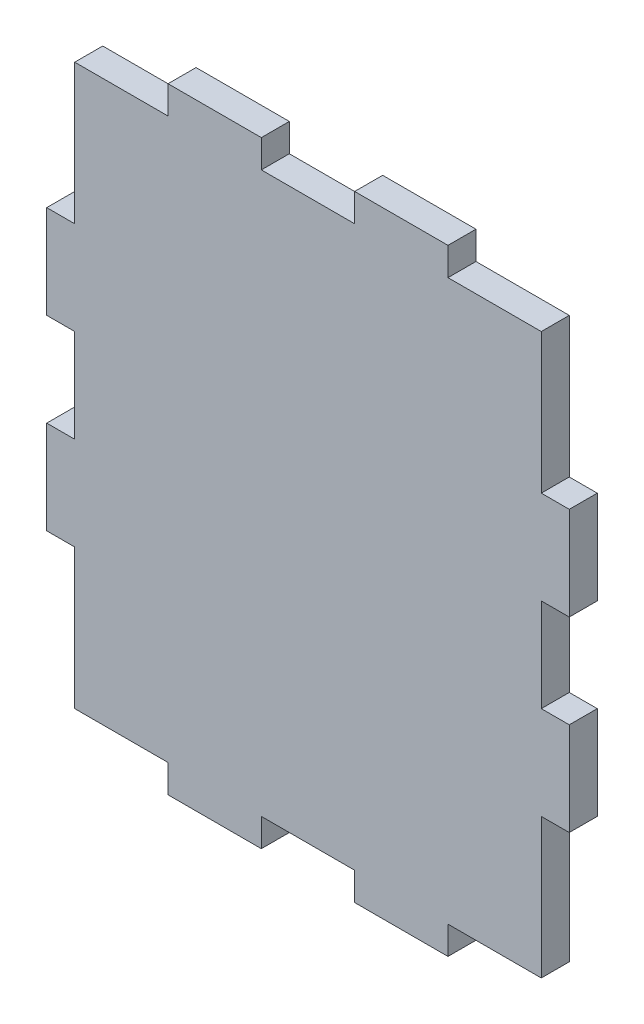
ISO-10303-21;
HEADER;
FILE_DESCRIPTION(('STEP AP214'),'2;1');
FILE_NAME('part.step','',(''),(''),'','','');
FILE_SCHEMA(('AUTOMOTIVE_DESIGN { 1 0 10303 214 1 1 1 1 }'));
ENDSEC;
DATA;
#1=APPLICATION_CONTEXT('core data for automotive mechanical design processes');
#2=APPLICATION_PROTOCOL_DEFINITION('international standard','automotive_design',2000,#1);
#3=PRODUCT_CONTEXT('',#1,'mechanical');
#4=PRODUCT('Part','Part','',(#3));
#5=PRODUCT_RELATED_PRODUCT_CATEGORY('part','',(#4));
#6=PRODUCT_DEFINITION_FORMATION('','',#4);
#7=PRODUCT_DEFINITION_CONTEXT('part definition',#1,'design');
#8=PRODUCT_DEFINITION('design','',#6,#7);
#9=PRODUCT_DEFINITION_SHAPE('','',#8);
#10=(LENGTH_UNIT() NAMED_UNIT(*) SI_UNIT(.MILLI.,.METRE.));
#11=(NAMED_UNIT(*) PLANE_ANGLE_UNIT() SI_UNIT($,.RADIAN.));
#12=(NAMED_UNIT(*) SI_UNIT($,.STERADIAN.) SOLID_ANGLE_UNIT());
#13=UNCERTAINTY_MEASURE_WITH_UNIT(LENGTH_MEASURE(1.E-05),#10,'distance_accuracy_value','');
#14=(GEOMETRIC_REPRESENTATION_CONTEXT(3) GLOBAL_UNCERTAINTY_ASSIGNED_CONTEXT((#13)) GLOBAL_UNIT_ASSIGNED_CONTEXT((#10,
#11,#12)) REPRESENTATION_CONTEXT('',''));
#15=CARTESIAN_POINT('',(0.,0.,0.));
#16=DIRECTION('',(0.,0.,1.));
#17=DIRECTION('',(1.,0.,0.));
#18=AXIS2_PLACEMENT_3D('',#15,#16,#17);
#19=CARTESIAN_POINT('',(-40.,-30.,6.));
#20=DIRECTION('',(1.,0.,0.));
#21=DIRECTION('',(0.,0.,-1.));
#22=AXIS2_PLACEMENT_3D('',#19,#20,#21);
#23=PLANE('',#22);
#24=DIRECTION('',(0.,-1.,0.));
#25=VECTOR('',#24,1.);
#26=CARTESIAN_POINT('',(-40.,-30.,0.));
#27=LINE('',#26,#25);
#28=CARTESIAN_POINT('',(-40.,0.,0.));
#29=VERTEX_POINT('',#28);
#30=CARTESIAN_POINT('',(-40.,-30.,0.));
#31=VERTEX_POINT('',#30);
#32=EDGE_CURVE('E297',#29,#31,#27,.T.);
#33=ORIENTED_EDGE('',*,*,#32,.T.);
#34=DIRECTION('',(0.,0.,-1.));
#35=VECTOR('',#34,1.);
#36=CARTESIAN_POINT('',(-40.,-30.,6.));
#37=LINE('',#36,#35);
#38=CARTESIAN_POINT('',(-40.,-30.,6.));
#39=VERTEX_POINT('',#38);
#40=EDGE_CURVE('E11',#39,#31,#37,.T.);
#41=ORIENTED_EDGE('',*,*,#40,.F.);
#42=DIRECTION('',(0.,-1.,0.));
#43=VECTOR('',#42,1.);
#44=CARTESIAN_POINT('',(-40.,-30.,6.));
#45=LINE('',#44,#43);
#46=CARTESIAN_POINT('',(-40.,0.,6.));
#47=VERTEX_POINT('',#46);
#48=EDGE_CURVE('E367',#47,#39,#45,.T.);
#49=ORIENTED_EDGE('',*,*,#48,.F.);
#50=DIRECTION('',(0.,0.,-1.));
#51=VECTOR('',#50,1.);
#52=CARTESIAN_POINT('',(-40.,0.,6.));
#53=LINE('',#52,#51);
#54=EDGE_CURVE('E293',#47,#29,#53,.T.);
#55=ORIENTED_EDGE('',*,*,#54,.T.);
#56=EDGE_LOOP('',(#33,#41,#49,#55));
#57=FACE_BOUND('',#56,.T.);
#58=ADVANCED_FACE('F33',(#57),#23,.F.);
#59=CARTESIAN_POINT('',(-46.,-30.,6.));
#60=DIRECTION('',(0.,-1.,0.));
#61=DIRECTION('',(0.,0.,-1.));
#62=AXIS2_PLACEMENT_3D('',#59,#60,#61);
#63=PLANE('',#62);
#64=DIRECTION('',(-1.,0.,0.));
#65=VECTOR('',#64,1.);
#66=CARTESIAN_POINT('',(-46.,-30.,0.));
#67=LINE('',#66,#65);
#68=CARTESIAN_POINT('',(-46.,-30.,0.));
#69=VERTEX_POINT('',#68);
#70=EDGE_CURVE('E300',#31,#69,#67,.T.);
#71=ORIENTED_EDGE('',*,*,#70,.T.);
#72=DIRECTION('',(0.,0.,-1.));
#73=VECTOR('',#72,1.);
#74=CARTESIAN_POINT('',(-46.,-30.,6.));
#75=LINE('',#74,#73);
#76=CARTESIAN_POINT('',(-46.,-30.,6.));
#77=VERTEX_POINT('',#76);
#78=EDGE_CURVE('E41',#77,#69,#75,.T.);
#79=ORIENTED_EDGE('',*,*,#78,.F.);
#80=DIRECTION('',(-1.,0.,0.));
#81=VECTOR('',#80,1.);
#82=CARTESIAN_POINT('',(-46.,-30.,6.));
#83=LINE('',#82,#81);
#84=EDGE_CURVE('E176',#39,#77,#83,.T.);
#85=ORIENTED_EDGE('',*,*,#84,.F.);
#86=ORIENTED_EDGE('',*,*,#40,.T.);
#87=EDGE_LOOP('',(#71,#79,#85,#86));
#88=FACE_BOUND('',#87,.T.);
#89=ADVANCED_FACE('F565',(#88),#63,.F.);
#90=CARTESIAN_POINT('',(-46.,-50.,6.));
#91=DIRECTION('',(1.,0.,0.));
#92=DIRECTION('',(0.,1.,0.));
#93=AXIS2_PLACEMENT_3D('',#90,#91,#92);
#94=PLANE('',#93);
#95=DIRECTION('',(0.,-1.,0.));
#96=VECTOR('',#95,1.);
#97=CARTESIAN_POINT('',(-46.,-50.,0.));
#98=LINE('',#97,#96);
#99=CARTESIAN_POINT('',(-46.,-50.,0.));
#100=VERTEX_POINT('',#99);
#101=EDGE_CURVE('E302',#69,#100,#98,.T.);
#102=ORIENTED_EDGE('',*,*,#101,.T.);
#103=DIRECTION('',(0.,0.,-1.));
#104=VECTOR('',#103,1.);
#105=CARTESIAN_POINT('',(-46.,-50.,6.));
#106=LINE('',#105,#104);
#107=CARTESIAN_POINT('',(-46.,-50.,6.));
#108=VERTEX_POINT('',#107);
#109=EDGE_CURVE('E458',#108,#100,#106,.T.);
#110=ORIENTED_EDGE('',*,*,#109,.F.);
#111=DIRECTION('',(0.,-1.,0.));
#112=VECTOR('',#111,1.);
#113=CARTESIAN_POINT('',(-46.,-50.,6.));
#114=LINE('',#113,#112);
#115=EDGE_CURVE('E466',#77,#108,#114,.T.);
#116=ORIENTED_EDGE('',*,*,#115,.F.);
#117=ORIENTED_EDGE('',*,*,#78,.T.);
#118=EDGE_LOOP('',(#102,#110,#116,#117));
#119=FACE_BOUND('',#118,.T.);
#120=ADVANCED_FACE('F464',(#119),#94,.F.);
#121=CARTESIAN_POINT('',(-40.,-50.,6.));
#122=DIRECTION('',(0.,1.,0.));
#123=DIRECTION('',(0.,0.,1.));
#124=AXIS2_PLACEMENT_3D('',#121,#122,#123);
#125=PLANE('',#124);
#126=DIRECTION('',(1.,0.,0.));
#127=VECTOR('',#126,1.);
#128=CARTESIAN_POINT('',(-40.,-50.,0.));
#129=LINE('',#128,#127);
#130=CARTESIAN_POINT('',(-40.,-50.,0.));
#131=VERTEX_POINT('',#130);
#132=EDGE_CURVE('E304',#100,#131,#129,.T.);
#133=ORIENTED_EDGE('',*,*,#132,.T.);
#134=DIRECTION('',(0.,0.,-1.));
#135=VECTOR('',#134,1.);
#136=CARTESIAN_POINT('',(-40.,-50.,6.));
#137=LINE('',#136,#135);
#138=CARTESIAN_POINT('',(-40.,-50.,6.));
#139=VERTEX_POINT('',#138);
#140=EDGE_CURVE('E455',#139,#131,#137,.T.);
#141=ORIENTED_EDGE('',*,*,#140,.F.);
#142=DIRECTION('',(1.,0.,0.));
#143=VECTOR('',#142,1.);
#144=CARTESIAN_POINT('',(-40.,-50.,6.));
#145=LINE('',#144,#143);
#146=EDGE_CURVE('E484',#108,#139,#145,.T.);
#147=ORIENTED_EDGE('',*,*,#146,.F.);
#148=ORIENTED_EDGE('',*,*,#109,.T.);
#149=EDGE_LOOP('',(#133,#141,#147,#148));
#150=FACE_BOUND('',#149,.T.);
#151=ADVANCED_FACE('F475',(#150),#125,.F.);
#152=CARTESIAN_POINT('',(-40.,-70.,6.));
#153=DIRECTION('',(1.,0.,0.));
#154=DIRECTION('',(0.,0.,-1.));
#155=AXIS2_PLACEMENT_3D('',#152,#153,#154);
#156=PLANE('',#155);
#157=DIRECTION('',(0.,-1.,0.));
#158=VECTOR('',#157,1.);
#159=CARTESIAN_POINT('',(-40.,-70.,0.));
#160=LINE('',#159,#158);
#161=CARTESIAN_POINT('',(-40.,-70.,0.));
#162=VERTEX_POINT('',#161);
#163=EDGE_CURVE('E306',#131,#162,#160,.T.);
#164=ORIENTED_EDGE('',*,*,#163,.T.);
#165=DIRECTION('',(0.,0.,-1.));
#166=VECTOR('',#165,1.);
#167=CARTESIAN_POINT('',(-40.,-70.,6.));
#168=LINE('',#167,#166);
#169=CARTESIAN_POINT('',(-40.,-70.,6.));
#170=VERTEX_POINT('',#169);
#171=EDGE_CURVE('E452',#170,#162,#168,.T.);
#172=ORIENTED_EDGE('',*,*,#171,.F.);
#173=DIRECTION('',(0.,-1.,0.));
#174=VECTOR('',#173,1.);
#175=CARTESIAN_POINT('',(-40.,-70.,6.));
#176=LINE('',#175,#174);
#177=EDGE_CURVE('E481',#139,#170,#176,.T.);
#178=ORIENTED_EDGE('',*,*,#177,.F.);
#179=ORIENTED_EDGE('',*,*,#140,.T.);
#180=EDGE_LOOP('',(#164,#172,#178,#179));
#181=FACE_BOUND('',#180,.T.);
#182=ADVANCED_FACE('F479',(#181),#156,.F.);
#183=CARTESIAN_POINT('',(-46.,-70.,6.));
#184=DIRECTION('',(0.,-1.,0.));
#185=DIRECTION('',(0.,0.,-1.));
#186=AXIS2_PLACEMENT_3D('',#183,#184,#185);
#187=PLANE('',#186);
#188=DIRECTION('',(-1.,0.,0.));
#189=VECTOR('',#188,1.);
#190=CARTESIAN_POINT('',(-46.,-70.,0.));
#191=LINE('',#190,#189);
#192=CARTESIAN_POINT('',(-46.,-70.,0.));
#193=VERTEX_POINT('',#192);
#194=EDGE_CURVE('E308',#162,#193,#191,.T.);
#195=ORIENTED_EDGE('',*,*,#194,.T.);
#196=DIRECTION('',(0.,0.,-1.));
#197=VECTOR('',#196,1.);
#198=CARTESIAN_POINT('',(-46.,-70.,6.));
#199=LINE('',#198,#197);
#200=CARTESIAN_POINT('',(-46.,-70.,6.));
#201=VERTEX_POINT('',#200);
#202=EDGE_CURVE('E449',#201,#193,#199,.T.);
#203=ORIENTED_EDGE('',*,*,#202,.F.);
#204=DIRECTION('',(-1.,0.,0.));
#205=VECTOR('',#204,1.);
#206=CARTESIAN_POINT('',(-46.,-70.,6.));
#207=LINE('',#206,#205);
#208=EDGE_CURVE('E483',#170,#201,#207,.T.);
#209=ORIENTED_EDGE('',*,*,#208,.F.);
#210=ORIENTED_EDGE('',*,*,#171,.T.);
#211=EDGE_LOOP('',(#195,#203,#209,#210));
#212=FACE_BOUND('',#211,.T.);
#213=ADVANCED_FACE('F578',(#212),#187,.F.);
#214=CARTESIAN_POINT('',(-46.,-90.,6.));
#215=DIRECTION('',(1.,0.,0.));
#216=DIRECTION('',(0.,1.,0.));
#217=AXIS2_PLACEMENT_3D('',#214,#215,#216);
#218=PLANE('',#217);
#219=DIRECTION('',(0.,-1.,0.));
#220=VECTOR('',#219,1.);
#221=CARTESIAN_POINT('',(-46.,-90.,0.));
#222=LINE('',#221,#220);
#223=CARTESIAN_POINT('',(-46.,-90.,0.));
#224=VERTEX_POINT('',#223);
#225=EDGE_CURVE('E310',#193,#224,#222,.T.);
#226=ORIENTED_EDGE('',*,*,#225,.T.);
#227=DIRECTION('',(0.,0.,-1.));
#228=VECTOR('',#227,1.);
#229=CARTESIAN_POINT('',(-46.,-90.,6.));
#230=LINE('',#229,#228);
#231=CARTESIAN_POINT('',(-46.,-90.,6.));
#232=VERTEX_POINT('',#231);
#233=EDGE_CURVE('E446',#232,#224,#230,.T.);
#234=ORIENTED_EDGE('',*,*,#233,.F.);
#235=DIRECTION('',(0.,-1.,0.));
#236=VECTOR('',#235,1.);
#237=CARTESIAN_POINT('',(-46.,-90.,6.));
#238=LINE('',#237,#236);
#239=EDGE_CURVE('E486',#201,#232,#238,.T.);
#240=ORIENTED_EDGE('',*,*,#239,.F.);
#241=ORIENTED_EDGE('',*,*,#202,.T.);
#242=EDGE_LOOP('',(#226,#234,#240,#241));
#243=FACE_BOUND('',#242,.T.);
#244=ADVANCED_FACE('F581',(#243),#218,.F.);
#245=CARTESIAN_POINT('',(-40.,-90.,6.));
#246=DIRECTION('',(0.,1.,0.));
#247=DIRECTION('',(0.,0.,1.));
#248=AXIS2_PLACEMENT_3D('',#245,#246,#247);
#249=PLANE('',#248);
#250=DIRECTION('',(1.,0.,0.));
#251=VECTOR('',#250,1.);
#252=CARTESIAN_POINT('',(-40.,-90.,0.));
#253=LINE('',#252,#251);
#254=CARTESIAN_POINT('',(-40.,-90.,0.));
#255=VERTEX_POINT('',#254);
#256=EDGE_CURVE('E312',#224,#255,#253,.T.);
#257=ORIENTED_EDGE('',*,*,#256,.T.);
#258=DIRECTION('',(0.,0.,-1.));
#259=VECTOR('',#258,1.);
#260=CARTESIAN_POINT('',(-40.,-90.,6.));
#261=LINE('',#260,#259);
#262=CARTESIAN_POINT('',(-40.,-90.,6.));
#263=VERTEX_POINT('',#262);
#264=EDGE_CURVE('E443',#263,#255,#261,.T.);
#265=ORIENTED_EDGE('',*,*,#264,.F.);
#266=DIRECTION('',(1.,0.,0.));
#267=VECTOR('',#266,1.);
#268=CARTESIAN_POINT('',(-40.,-90.,6.));
#269=LINE('',#268,#267);
#270=EDGE_CURVE('E492',#232,#263,#269,.T.);
#271=ORIENTED_EDGE('',*,*,#270,.F.);
#272=ORIENTED_EDGE('',*,*,#233,.T.);
#273=EDGE_LOOP('',(#257,#265,#271,#272));
#274=FACE_BOUND('',#273,.T.);
#275=ADVANCED_FACE('F585',(#274),#249,.F.);
#276=CARTESIAN_POINT('',(-40.,-120.,6.));
#277=DIRECTION('',(1.,0.,0.));
#278=DIRECTION('',(0.,1.,0.));
#279=AXIS2_PLACEMENT_3D('',#276,#277,#278);
#280=PLANE('',#279);
#281=DIRECTION('',(0.,-1.,0.));
#282=VECTOR('',#281,1.);
#283=CARTESIAN_POINT('',(-40.,-120.,0.));
#284=LINE('',#283,#282);
#285=CARTESIAN_POINT('',(-40.,-120.,0.));
#286=VERTEX_POINT('',#285);
#287=EDGE_CURVE('E314',#255,#286,#284,.T.);
#288=ORIENTED_EDGE('',*,*,#287,.T.);
#289=DIRECTION('',(0.,0.,-1.));
#290=VECTOR('',#289,1.);
#291=CARTESIAN_POINT('',(-40.,-120.,6.));
#292=LINE('',#291,#290);
#293=CARTESIAN_POINT('',(-40.,-120.,6.));
#294=VERTEX_POINT('',#293);
#295=EDGE_CURVE('E440',#294,#286,#292,.T.);
#296=ORIENTED_EDGE('',*,*,#295,.F.);
#297=DIRECTION('',(0.,-1.,0.));
#298=VECTOR('',#297,1.);
#299=CARTESIAN_POINT('',(-40.,-120.,6.));
#300=LINE('',#299,#298);
#301=EDGE_CURVE('E494',#263,#294,#300,.T.);
#302=ORIENTED_EDGE('',*,*,#301,.F.);
#303=ORIENTED_EDGE('',*,*,#264,.T.);
#304=EDGE_LOOP('',(#288,#296,#302,#303));
#305=FACE_BOUND('',#304,.T.);
#306=ADVANCED_FACE('F589',(#305),#280,.F.);
#307=CARTESIAN_POINT('',(-20.,-120.,6.));
#308=DIRECTION('',(0.,1.,0.));
#309=DIRECTION('',(-1.,0.,0.));
#310=AXIS2_PLACEMENT_3D('',#307,#308,#309);
#311=PLANE('',#310);
#312=DIRECTION('',(1.,0.,0.));
#313=VECTOR('',#312,1.);
#314=CARTESIAN_POINT('',(-20.,-120.,0.));
#315=LINE('',#314,#313);
#316=CARTESIAN_POINT('',(-20.,-120.,0.));
#317=VERTEX_POINT('',#316);
#318=EDGE_CURVE('E316',#286,#317,#315,.T.);
#319=ORIENTED_EDGE('',*,*,#318,.T.);
#320=DIRECTION('',(0.,0.,-1.));
#321=VECTOR('',#320,1.);
#322=CARTESIAN_POINT('',(-20.,-120.,6.));
#323=LINE('',#322,#321);
#324=CARTESIAN_POINT('',(-20.,-120.,6.));
#325=VERTEX_POINT('',#324);
#326=EDGE_CURVE('E437',#325,#317,#323,.T.);
#327=ORIENTED_EDGE('',*,*,#326,.F.);
#328=DIRECTION('',(1.,0.,0.));
#329=VECTOR('',#328,1.);
#330=CARTESIAN_POINT('',(-20.,-120.,6.));
#331=LINE('',#330,#329);
#332=EDGE_CURVE('E496',#294,#325,#331,.T.);
#333=ORIENTED_EDGE('',*,*,#332,.F.);
#334=ORIENTED_EDGE('',*,*,#295,.T.);
#335=EDGE_LOOP('',(#319,#327,#333,#334));
#336=FACE_BOUND('',#335,.T.);
#337=ADVANCED_FACE('F593',(#336),#311,.F.);
#338=CARTESIAN_POINT('',(-20.,-126.,6.));
#339=DIRECTION('',(1.,0.,0.));
#340=DIRECTION('',(0.,1.,0.));
#341=AXIS2_PLACEMENT_3D('',#338,#339,#340);
#342=PLANE('',#341);
#343=DIRECTION('',(0.,-1.,0.));
#344=VECTOR('',#343,1.);
#345=CARTESIAN_POINT('',(-20.,-126.,0.));
#346=LINE('',#345,#344);
#347=CARTESIAN_POINT('',(-20.,-126.,0.));
#348=VERTEX_POINT('',#347);
#349=EDGE_CURVE('E318',#317,#348,#346,.T.);
#350=ORIENTED_EDGE('',*,*,#349,.T.);
#351=DIRECTION('',(0.,0.,-1.));
#352=VECTOR('',#351,1.);
#353=CARTESIAN_POINT('',(-20.,-126.,6.));
#354=LINE('',#353,#352);
#355=CARTESIAN_POINT('',(-20.,-126.,6.));
#356=VERTEX_POINT('',#355);
#357=EDGE_CURVE('E434',#356,#348,#354,.T.);
#358=ORIENTED_EDGE('',*,*,#357,.F.);
#359=DIRECTION('',(0.,-1.,0.));
#360=VECTOR('',#359,1.);
#361=CARTESIAN_POINT('',(-20.,-126.,6.));
#362=LINE('',#361,#360);
#363=EDGE_CURVE('E498',#325,#356,#362,.T.);
#364=ORIENTED_EDGE('',*,*,#363,.F.);
#365=ORIENTED_EDGE('',*,*,#326,.T.);
#366=EDGE_LOOP('',(#350,#358,#364,#365));
#367=FACE_BOUND('',#366,.T.);
#368=ADVANCED_FACE('F597',(#367),#342,.F.);
#369=CARTESIAN_POINT('',(0.,-126.,6.));
#370=DIRECTION('',(0.,1.,0.));
#371=DIRECTION('',(0.,0.,1.));
#372=AXIS2_PLACEMENT_3D('',#369,#370,#371);
#373=PLANE('',#372);
#374=DIRECTION('',(1.,0.,0.));
#375=VECTOR('',#374,1.);
#376=CARTESIAN_POINT('',(0.,-126.,0.));
#377=LINE('',#376,#375);
#378=CARTESIAN_POINT('',(0.,-126.,0.));
#379=VERTEX_POINT('',#378);
#380=EDGE_CURVE('E320',#348,#379,#377,.T.);
#381=ORIENTED_EDGE('',*,*,#380,.T.);
#382=DIRECTION('',(0.,0.,-1.));
#383=VECTOR('',#382,1.);
#384=CARTESIAN_POINT('',(0.,-126.,6.));
#385=LINE('',#384,#383);
#386=CARTESIAN_POINT('',(0.,-126.,6.));
#387=VERTEX_POINT('',#386);
#388=EDGE_CURVE('E431',#387,#379,#385,.T.);
#389=ORIENTED_EDGE('',*,*,#388,.F.);
#390=DIRECTION('',(1.,0.,0.));
#391=VECTOR('',#390,1.);
#392=CARTESIAN_POINT('',(0.,-126.,6.));
#393=LINE('',#392,#391);
#394=EDGE_CURVE('E500',#356,#387,#393,.T.);
#395=ORIENTED_EDGE('',*,*,#394,.F.);
#396=ORIENTED_EDGE('',*,*,#357,.T.);
#397=EDGE_LOOP('',(#381,#389,#395,#396));
#398=FACE_BOUND('',#397,.T.);
#399=ADVANCED_FACE('F601',(#398),#373,.F.);
#400=CARTESIAN_POINT('',(0.,-120.,6.));
#401=DIRECTION('',(-1.,0.,0.));
#402=DIRECTION('',(0.,-1.,0.));
#403=AXIS2_PLACEMENT_3D('',#400,#401,#402);
#404=PLANE('',#403);
#405=DIRECTION('',(0.,1.,0.));
#406=VECTOR('',#405,1.);
#407=CARTESIAN_POINT('',(0.,-120.,0.));
#408=LINE('',#407,#406);
#409=CARTESIAN_POINT('',(0.,-120.,0.));
#410=VERTEX_POINT('',#409);
#411=EDGE_CURVE('E322',#379,#410,#408,.T.);
#412=ORIENTED_EDGE('',*,*,#411,.T.);
#413=DIRECTION('',(0.,0.,-1.));
#414=VECTOR('',#413,1.);
#415=CARTESIAN_POINT('',(0.,-120.,6.));
#416=LINE('',#415,#414);
#417=CARTESIAN_POINT('',(0.,-120.,6.));
#418=VERTEX_POINT('',#417);
#419=EDGE_CURVE('E428',#418,#410,#416,.T.);
#420=ORIENTED_EDGE('',*,*,#419,.F.);
#421=DIRECTION('',(0.,1.,0.));
#422=VECTOR('',#421,1.);
#423=CARTESIAN_POINT('',(0.,-120.,6.));
#424=LINE('',#423,#422);
#425=EDGE_CURVE('E502',#387,#418,#424,.T.);
#426=ORIENTED_EDGE('',*,*,#425,.F.);
#427=ORIENTED_EDGE('',*,*,#388,.T.);
#428=EDGE_LOOP('',(#412,#420,#426,#427));
#429=FACE_BOUND('',#428,.T.);
#430=ADVANCED_FACE('F605',(#429),#404,.F.);
#431=CARTESIAN_POINT('',(20.,-120.,6.));
#432=DIRECTION('',(0.,1.,0.));
#433=DIRECTION('',(0.,0.,1.));
#434=AXIS2_PLACEMENT_3D('',#431,#432,#433);
#435=PLANE('',#434);
#436=DIRECTION('',(1.,0.,0.));
#437=VECTOR('',#436,1.);
#438=CARTESIAN_POINT('',(20.,-120.,0.));
#439=LINE('',#438,#437);
#440=CARTESIAN_POINT('',(20.,-120.,0.));
#441=VERTEX_POINT('',#440);
#442=EDGE_CURVE('E324',#410,#441,#439,.T.);
#443=ORIENTED_EDGE('',*,*,#442,.T.);
#444=DIRECTION('',(0.,0.,-1.));
#445=VECTOR('',#444,1.);
#446=CARTESIAN_POINT('',(20.,-120.,6.));
#447=LINE('',#446,#445);
#448=CARTESIAN_POINT('',(20.,-120.,6.));
#449=VERTEX_POINT('',#448);
#450=EDGE_CURVE('E425',#449,#441,#447,.T.);
#451=ORIENTED_EDGE('',*,*,#450,.F.);
#452=DIRECTION('',(1.,0.,0.));
#453=VECTOR('',#452,1.);
#454=CARTESIAN_POINT('',(20.,-120.,6.));
#455=LINE('',#454,#453);
#456=EDGE_CURVE('E504',#418,#449,#455,.T.);
#457=ORIENTED_EDGE('',*,*,#456,.F.);
#458=ORIENTED_EDGE('',*,*,#419,.T.);
#459=EDGE_LOOP('',(#443,#451,#457,#458));
#460=FACE_BOUND('',#459,.T.);
#461=ADVANCED_FACE('F609',(#460),#435,.F.);
#462=CARTESIAN_POINT('',(20.,-126.,6.));
#463=DIRECTION('',(1.,0.,0.));
#464=DIRECTION('',(0.,0.,-1.));
#465=AXIS2_PLACEMENT_3D('',#462,#463,#464);
#466=PLANE('',#465);
#467=DIRECTION('',(0.,-1.,0.));
#468=VECTOR('',#467,1.);
#469=CARTESIAN_POINT('',(20.,-126.,0.));
#470=LINE('',#469,#468);
#471=CARTESIAN_POINT('',(20.,-126.,0.));
#472=VERTEX_POINT('',#471);
#473=EDGE_CURVE('E326',#441,#472,#470,.T.);
#474=ORIENTED_EDGE('',*,*,#473,.T.);
#475=DIRECTION('',(0.,0.,-1.));
#476=VECTOR('',#475,1.);
#477=CARTESIAN_POINT('',(20.,-126.,6.));
#478=LINE('',#477,#476);
#479=CARTESIAN_POINT('',(20.,-126.,6.));
#480=VERTEX_POINT('',#479);
#481=EDGE_CURVE('E422',#480,#472,#478,.T.);
#482=ORIENTED_EDGE('',*,*,#481,.F.);
#483=DIRECTION('',(0.,-1.,0.));
#484=VECTOR('',#483,1.);
#485=CARTESIAN_POINT('',(20.,-126.,6.));
#486=LINE('',#485,#484);
#487=EDGE_CURVE('E506',#449,#480,#486,.T.);
#488=ORIENTED_EDGE('',*,*,#487,.F.);
#489=ORIENTED_EDGE('',*,*,#450,.T.);
#490=EDGE_LOOP('',(#474,#482,#488,#489));
#491=FACE_BOUND('',#490,.T.);
#492=ADVANCED_FACE('F613',(#491),#466,.F.);
#493=CARTESIAN_POINT('',(40.,-126.,6.));
#494=DIRECTION('',(0.,1.,0.));
#495=DIRECTION('',(0.,0.,1.));
#496=AXIS2_PLACEMENT_3D('',#493,#494,#495);
#497=PLANE('',#496);
#498=DIRECTION('',(1.,0.,0.));
#499=VECTOR('',#498,1.);
#500=CARTESIAN_POINT('',(40.,-126.,0.));
#501=LINE('',#500,#499);
#502=CARTESIAN_POINT('',(40.,-126.,0.));
#503=VERTEX_POINT('',#502);
#504=EDGE_CURVE('E328',#472,#503,#501,.T.);
#505=ORIENTED_EDGE('',*,*,#504,.T.);
#506=DIRECTION('',(0.,0.,-1.));
#507=VECTOR('',#506,1.);
#508=CARTESIAN_POINT('',(40.,-126.,6.));
#509=LINE('',#508,#507);
#510=CARTESIAN_POINT('',(40.,-126.,6.));
#511=VERTEX_POINT('',#510);
#512=EDGE_CURVE('E419',#511,#503,#509,.T.);
#513=ORIENTED_EDGE('',*,*,#512,.F.);
#514=DIRECTION('',(1.,0.,0.));
#515=VECTOR('',#514,1.);
#516=CARTESIAN_POINT('',(40.,-126.,6.));
#517=LINE('',#516,#515);
#518=EDGE_CURVE('E508',#480,#511,#517,.T.);
#519=ORIENTED_EDGE('',*,*,#518,.F.);
#520=ORIENTED_EDGE('',*,*,#481,.T.);
#521=EDGE_LOOP('',(#505,#513,#519,#520));
#522=FACE_BOUND('',#521,.T.);
#523=ADVANCED_FACE('F617',(#522),#497,.F.);
#524=CARTESIAN_POINT('',(40.,-120.,6.));
#525=DIRECTION('',(-1.,0.,0.));
#526=DIRECTION('',(0.,-1.,0.));
#527=AXIS2_PLACEMENT_3D('',#524,#525,#526);
#528=PLANE('',#527);
#529=DIRECTION('',(0.,1.,0.));
#530=VECTOR('',#529,1.);
#531=CARTESIAN_POINT('',(40.,-120.,0.));
#532=LINE('',#531,#530);
#533=CARTESIAN_POINT('',(40.,-120.,0.));
#534=VERTEX_POINT('',#533);
#535=EDGE_CURVE('E330',#503,#534,#532,.T.);
#536=ORIENTED_EDGE('',*,*,#535,.T.);
#537=DIRECTION('',(0.,0.,-1.));
#538=VECTOR('',#537,1.);
#539=CARTESIAN_POINT('',(40.,-120.,6.));
#540=LINE('',#539,#538);
#541=CARTESIAN_POINT('',(40.,-120.,6.));
#542=VERTEX_POINT('',#541);
#543=EDGE_CURVE('E416',#542,#534,#540,.T.);
#544=ORIENTED_EDGE('',*,*,#543,.F.);
#545=DIRECTION('',(0.,1.,0.));
#546=VECTOR('',#545,1.);
#547=CARTESIAN_POINT('',(40.,-120.,6.));
#548=LINE('',#547,#546);
#549=EDGE_CURVE('E510',#511,#542,#548,.T.);
#550=ORIENTED_EDGE('',*,*,#549,.F.);
#551=ORIENTED_EDGE('',*,*,#512,.T.);
#552=EDGE_LOOP('',(#536,#544,#550,#551));
#553=FACE_BOUND('',#552,.T.);
#554=ADVANCED_FACE('F621',(#553),#528,.F.);
#555=CARTESIAN_POINT('',(60.,-120.,6.));
#556=DIRECTION('',(0.,1.,0.));
#557=DIRECTION('',(-1.,0.,0.));
#558=AXIS2_PLACEMENT_3D('',#555,#556,#557);
#559=PLANE('',#558);
#560=DIRECTION('',(1.,0.,0.));
#561=VECTOR('',#560,1.);
#562=CARTESIAN_POINT('',(60.,-120.,0.));
#563=LINE('',#562,#561);
#564=CARTESIAN_POINT('',(60.,-120.,0.));
#565=VERTEX_POINT('',#564);
#566=EDGE_CURVE('E332',#534,#565,#563,.T.);
#567=ORIENTED_EDGE('',*,*,#566,.T.);
#568=DIRECTION('',(0.,0.,-1.));
#569=VECTOR('',#568,1.);
#570=CARTESIAN_POINT('',(60.,-120.,6.));
#571=LINE('',#570,#569);
#572=CARTESIAN_POINT('',(60.,-120.,6.));
#573=VERTEX_POINT('',#572);
#574=EDGE_CURVE('E413',#573,#565,#571,.T.);
#575=ORIENTED_EDGE('',*,*,#574,.F.);
#576=DIRECTION('',(1.,0.,0.));
#577=VECTOR('',#576,1.);
#578=CARTESIAN_POINT('',(60.,-120.,6.));
#579=LINE('',#578,#577);
#580=EDGE_CURVE('E512',#542,#573,#579,.T.);
#581=ORIENTED_EDGE('',*,*,#580,.F.);
#582=ORIENTED_EDGE('',*,*,#543,.T.);
#583=EDGE_LOOP('',(#567,#575,#581,#582));
#584=FACE_BOUND('',#583,.T.);
#585=ADVANCED_FACE('F625',(#584),#559,.F.);
#586=CARTESIAN_POINT('',(60.,-90.,6.));
#587=DIRECTION('',(-1.,0.,0.));
#588=DIRECTION('',(0.,0.,1.));
#589=AXIS2_PLACEMENT_3D('',#586,#587,#588);
#590=PLANE('',#589);
#591=DIRECTION('',(0.,1.,0.));
#592=VECTOR('',#591,1.);
#593=CARTESIAN_POINT('',(60.,-90.,0.));
#594=LINE('',#593,#592);
#595=CARTESIAN_POINT('',(60.,-90.,0.));
#596=VERTEX_POINT('',#595);
#597=EDGE_CURVE('E334',#565,#596,#594,.T.);
#598=ORIENTED_EDGE('',*,*,#597,.T.);
#599=DIRECTION('',(0.,0.,-1.));
#600=VECTOR('',#599,1.);
#601=CARTESIAN_POINT('',(60.,-90.,6.));
#602=LINE('',#601,#600);
#603=CARTESIAN_POINT('',(60.,-90.,6.));
#604=VERTEX_POINT('',#603);
#605=EDGE_CURVE('E410',#604,#596,#602,.T.);
#606=ORIENTED_EDGE('',*,*,#605,.F.);
#607=DIRECTION('',(0.,1.,0.));
#608=VECTOR('',#607,1.);
#609=CARTESIAN_POINT('',(60.,-90.,6.));
#610=LINE('',#609,#608);
#611=EDGE_CURVE('E514',#573,#604,#610,.T.);
#612=ORIENTED_EDGE('',*,*,#611,.F.);
#613=ORIENTED_EDGE('',*,*,#574,.T.);
#614=EDGE_LOOP('',(#598,#606,#612,#613));
#615=FACE_BOUND('',#614,.T.);
#616=ADVANCED_FACE('F629',(#615),#590,.F.);
#617=CARTESIAN_POINT('',(66.,-90.,6.));
#618=DIRECTION('',(0.,1.,0.));
#619=DIRECTION('',(0.,0.,1.));
#620=AXIS2_PLACEMENT_3D('',#617,#618,#619);
#621=PLANE('',#620);
#622=DIRECTION('',(1.,0.,0.));
#623=VECTOR('',#622,1.);
#624=CARTESIAN_POINT('',(66.,-90.,0.));
#625=LINE('',#624,#623);
#626=CARTESIAN_POINT('',(66.,-90.,0.));
#627=VERTEX_POINT('',#626);
#628=EDGE_CURVE('E336',#596,#627,#625,.T.);
#629=ORIENTED_EDGE('',*,*,#628,.T.);
#630=DIRECTION('',(0.,0.,-1.));
#631=VECTOR('',#630,1.);
#632=CARTESIAN_POINT('',(66.,-90.,6.));
#633=LINE('',#632,#631);
#634=CARTESIAN_POINT('',(66.,-90.,6.));
#635=VERTEX_POINT('',#634);
#636=EDGE_CURVE('E407',#635,#627,#633,.T.);
#637=ORIENTED_EDGE('',*,*,#636,.F.);
#638=DIRECTION('',(1.,0.,0.));
#639=VECTOR('',#638,1.);
#640=CARTESIAN_POINT('',(66.,-90.,6.));
#641=LINE('',#640,#639);
#642=EDGE_CURVE('E516',#604,#635,#641,.T.);
#643=ORIENTED_EDGE('',*,*,#642,.F.);
#644=ORIENTED_EDGE('',*,*,#605,.T.);
#645=EDGE_LOOP('',(#629,#637,#643,#644));
#646=FACE_BOUND('',#645,.T.);
#647=ADVANCED_FACE('F633',(#646),#621,.F.);
#648=CARTESIAN_POINT('',(66.,-70.,6.));
#649=DIRECTION('',(-1.,0.,0.));
#650=DIRECTION('',(0.,-1.,0.));
#651=AXIS2_PLACEMENT_3D('',#648,#649,#650);
#652=PLANE('',#651);
#653=DIRECTION('',(0.,1.,0.));
#654=VECTOR('',#653,1.);
#655=CARTESIAN_POINT('',(66.,-70.,0.));
#656=LINE('',#655,#654);
#657=CARTESIAN_POINT('',(66.,-70.,0.));
#658=VERTEX_POINT('',#657);
#659=EDGE_CURVE('E338',#627,#658,#656,.T.);
#660=ORIENTED_EDGE('',*,*,#659,.T.);
#661=DIRECTION('',(0.,0.,-1.));
#662=VECTOR('',#661,1.);
#663=CARTESIAN_POINT('',(66.,-70.,6.));
#664=LINE('',#663,#662);
#665=CARTESIAN_POINT('',(66.,-70.,6.));
#666=VERTEX_POINT('',#665);
#667=EDGE_CURVE('E404',#666,#658,#664,.T.);
#668=ORIENTED_EDGE('',*,*,#667,.F.);
#669=DIRECTION('',(0.,1.,0.));
#670=VECTOR('',#669,1.);
#671=CARTESIAN_POINT('',(66.,-70.,6.));
#672=LINE('',#671,#670);
#673=EDGE_CURVE('E518',#635,#666,#672,.T.);
#674=ORIENTED_EDGE('',*,*,#673,.F.);
#675=ORIENTED_EDGE('',*,*,#636,.T.);
#676=EDGE_LOOP('',(#660,#668,#674,#675));
#677=FACE_BOUND('',#676,.T.);
#678=ADVANCED_FACE('F637',(#677),#652,.F.);
#679=CARTESIAN_POINT('',(60.,-70.,6.));
#680=DIRECTION('',(0.,-1.,0.));
#681=DIRECTION('',(0.,0.,-1.));
#682=AXIS2_PLACEMENT_3D('',#679,#680,#681);
#683=PLANE('',#682);
#684=DIRECTION('',(-1.,0.,0.));
#685=VECTOR('',#684,1.);
#686=CARTESIAN_POINT('',(60.,-70.,0.));
#687=LINE('',#686,#685);
#688=CARTESIAN_POINT('',(60.,-70.,0.));
#689=VERTEX_POINT('',#688);
#690=EDGE_CURVE('E340',#658,#689,#687,.T.);
#691=ORIENTED_EDGE('',*,*,#690,.T.);
#692=DIRECTION('',(0.,0.,-1.));
#693=VECTOR('',#692,1.);
#694=CARTESIAN_POINT('',(60.,-70.,6.));
#695=LINE('',#694,#693);
#696=CARTESIAN_POINT('',(60.,-70.,6.));
#697=VERTEX_POINT('',#696);
#698=EDGE_CURVE('E401',#697,#689,#695,.T.);
#699=ORIENTED_EDGE('',*,*,#698,.F.);
#700=DIRECTION('',(-1.,0.,0.));
#701=VECTOR('',#700,1.);
#702=CARTESIAN_POINT('',(60.,-70.,6.));
#703=LINE('',#702,#701);
#704=EDGE_CURVE('E520',#666,#697,#703,.T.);
#705=ORIENTED_EDGE('',*,*,#704,.F.);
#706=ORIENTED_EDGE('',*,*,#667,.T.);
#707=EDGE_LOOP('',(#691,#699,#705,#706));
#708=FACE_BOUND('',#707,.T.);
#709=ADVANCED_FACE('F641',(#708),#683,.F.);
#710=CARTESIAN_POINT('',(60.,-50.,6.));
#711=DIRECTION('',(-1.,0.,0.));
#712=DIRECTION('',(0.,0.,1.));
#713=AXIS2_PLACEMENT_3D('',#710,#711,#712);
#714=PLANE('',#713);
#715=DIRECTION('',(0.,1.,0.));
#716=VECTOR('',#715,1.);
#717=CARTESIAN_POINT('',(60.,-50.,0.));
#718=LINE('',#717,#716);
#719=CARTESIAN_POINT('',(60.,-50.,0.));
#720=VERTEX_POINT('',#719);
#721=EDGE_CURVE('E342',#689,#720,#718,.T.);
#722=ORIENTED_EDGE('',*,*,#721,.T.);
#723=DIRECTION('',(0.,0.,-1.));
#724=VECTOR('',#723,1.);
#725=CARTESIAN_POINT('',(60.,-50.,6.));
#726=LINE('',#725,#724);
#727=CARTESIAN_POINT('',(60.,-50.,6.));
#728=VERTEX_POINT('',#727);
#729=EDGE_CURVE('E398',#728,#720,#726,.T.);
#730=ORIENTED_EDGE('',*,*,#729,.F.);
#731=DIRECTION('',(0.,1.,0.));
#732=VECTOR('',#731,1.);
#733=CARTESIAN_POINT('',(60.,-50.,6.));
#734=LINE('',#733,#732);
#735=EDGE_CURVE('E522',#697,#728,#734,.T.);
#736=ORIENTED_EDGE('',*,*,#735,.F.);
#737=ORIENTED_EDGE('',*,*,#698,.T.);
#738=EDGE_LOOP('',(#722,#730,#736,#737));
#739=FACE_BOUND('',#738,.T.);
#740=ADVANCED_FACE('F645',(#739),#714,.F.);
#741=CARTESIAN_POINT('',(66.,-50.,6.));
#742=DIRECTION('',(0.,1.,0.));
#743=DIRECTION('',(0.,0.,1.));
#744=AXIS2_PLACEMENT_3D('',#741,#742,#743);
#745=PLANE('',#744);
#746=DIRECTION('',(1.,0.,0.));
#747=VECTOR('',#746,1.);
#748=CARTESIAN_POINT('',(66.,-50.,0.));
#749=LINE('',#748,#747);
#750=CARTESIAN_POINT('',(66.,-50.,0.));
#751=VERTEX_POINT('',#750);
#752=EDGE_CURVE('E344',#720,#751,#749,.T.);
#753=ORIENTED_EDGE('',*,*,#752,.T.);
#754=DIRECTION('',(0.,0.,-1.));
#755=VECTOR('',#754,1.);
#756=CARTESIAN_POINT('',(66.,-50.,6.));
#757=LINE('',#756,#755);
#758=CARTESIAN_POINT('',(66.,-50.,6.));
#759=VERTEX_POINT('',#758);
#760=EDGE_CURVE('E395',#759,#751,#757,.T.);
#761=ORIENTED_EDGE('',*,*,#760,.F.);
#762=DIRECTION('',(1.,0.,0.));
#763=VECTOR('',#762,1.);
#764=CARTESIAN_POINT('',(66.,-50.,6.));
#765=LINE('',#764,#763);
#766=EDGE_CURVE('E524',#728,#759,#765,.T.);
#767=ORIENTED_EDGE('',*,*,#766,.F.);
#768=ORIENTED_EDGE('',*,*,#729,.T.);
#769=EDGE_LOOP('',(#753,#761,#767,#768));
#770=FACE_BOUND('',#769,.T.);
#771=ADVANCED_FACE('F649',(#770),#745,.F.);
#772=CARTESIAN_POINT('',(66.,-30.,6.));
#773=DIRECTION('',(-1.,0.,0.));
#774=DIRECTION('',(0.,0.,1.));
#775=AXIS2_PLACEMENT_3D('',#772,#773,#774);
#776=PLANE('',#775);
#777=DIRECTION('',(0.,1.,0.));
#778=VECTOR('',#777,1.);
#779=CARTESIAN_POINT('',(66.,-30.,0.));
#780=LINE('',#779,#778);
#781=CARTESIAN_POINT('',(66.,-30.,0.));
#782=VERTEX_POINT('',#781);
#783=EDGE_CURVE('E346',#751,#782,#780,.T.);
#784=ORIENTED_EDGE('',*,*,#783,.T.);
#785=DIRECTION('',(0.,0.,-1.));
#786=VECTOR('',#785,1.);
#787=CARTESIAN_POINT('',(66.,-30.,6.));
#788=LINE('',#787,#786);
#789=CARTESIAN_POINT('',(66.,-30.,6.));
#790=VERTEX_POINT('',#789);
#791=EDGE_CURVE('E392',#790,#782,#788,.T.);
#792=ORIENTED_EDGE('',*,*,#791,.F.);
#793=DIRECTION('',(0.,1.,0.));
#794=VECTOR('',#793,1.);
#795=CARTESIAN_POINT('',(66.,-30.,6.));
#796=LINE('',#795,#794);
#797=EDGE_CURVE('E526',#759,#790,#796,.T.);
#798=ORIENTED_EDGE('',*,*,#797,.F.);
#799=ORIENTED_EDGE('',*,*,#760,.T.);
#800=EDGE_LOOP('',(#784,#792,#798,#799));
#801=FACE_BOUND('',#800,.T.);
#802=ADVANCED_FACE('F653',(#801),#776,.F.);
#803=CARTESIAN_POINT('',(60.,-30.,6.));
#804=DIRECTION('',(0.,-1.,0.));
#805=DIRECTION('',(0.,0.,-1.));
#806=AXIS2_PLACEMENT_3D('',#803,#804,#805);
#807=PLANE('',#806);
#808=DIRECTION('',(-1.,0.,0.));
#809=VECTOR('',#808,1.);
#810=CARTESIAN_POINT('',(60.,-30.,0.));
#811=LINE('',#810,#809);
#812=CARTESIAN_POINT('',(60.,-30.,0.));
#813=VERTEX_POINT('',#812);
#814=EDGE_CURVE('E348',#782,#813,#811,.T.);
#815=ORIENTED_EDGE('',*,*,#814,.T.);
#816=DIRECTION('',(0.,0.,-1.));
#817=VECTOR('',#816,1.);
#818=CARTESIAN_POINT('',(60.,-30.,6.));
#819=LINE('',#818,#817);
#820=CARTESIAN_POINT('',(60.,-30.,6.));
#821=VERTEX_POINT('',#820);
#822=EDGE_CURVE('E389',#821,#813,#819,.T.);
#823=ORIENTED_EDGE('',*,*,#822,.F.);
#824=DIRECTION('',(-1.,0.,0.));
#825=VECTOR('',#824,1.);
#826=CARTESIAN_POINT('',(60.,-30.,6.));
#827=LINE('',#826,#825);
#828=EDGE_CURVE('E528',#790,#821,#827,.T.);
#829=ORIENTED_EDGE('',*,*,#828,.F.);
#830=ORIENTED_EDGE('',*,*,#791,.T.);
#831=EDGE_LOOP('',(#815,#823,#829,#830));
#832=FACE_BOUND('',#831,.T.);
#833=ADVANCED_FACE('F657',(#832),#807,.F.);
#834=CARTESIAN_POINT('',(60.,0.,6.));
#835=DIRECTION('',(-1.,0.,0.));
#836=DIRECTION('',(0.,0.,1.));
#837=AXIS2_PLACEMENT_3D('',#834,#835,#836);
#838=PLANE('',#837);
#839=DIRECTION('',(0.,1.,0.));
#840=VECTOR('',#839,1.);
#841=CARTESIAN_POINT('',(60.,0.,0.));
#842=LINE('',#841,#840);
#843=CARTESIAN_POINT('',(60.,0.,0.));
#844=VERTEX_POINT('',#843);
#845=EDGE_CURVE('E350',#813,#844,#842,.T.);
#846=ORIENTED_EDGE('',*,*,#845,.T.);
#847=DIRECTION('',(0.,0.,-1.));
#848=VECTOR('',#847,1.);
#849=CARTESIAN_POINT('',(60.,0.,6.));
#850=LINE('',#849,#848);
#851=CARTESIAN_POINT('',(60.,0.,6.));
#852=VERTEX_POINT('',#851);
#853=EDGE_CURVE('E386',#852,#844,#850,.T.);
#854=ORIENTED_EDGE('',*,*,#853,.F.);
#855=DIRECTION('',(0.,1.,0.));
#856=VECTOR('',#855,1.);
#857=CARTESIAN_POINT('',(60.,0.,6.));
#858=LINE('',#857,#856);
#859=EDGE_CURVE('E530',#821,#852,#858,.T.);
#860=ORIENTED_EDGE('',*,*,#859,.F.);
#861=ORIENTED_EDGE('',*,*,#822,.T.);
#862=EDGE_LOOP('',(#846,#854,#860,#861));
#863=FACE_BOUND('',#862,.T.);
#864=ADVANCED_FACE('F661',(#863),#838,.F.);
#865=CARTESIAN_POINT('',(40.,0.,6.));
#866=DIRECTION('',(0.,-1.,0.));
#867=DIRECTION('',(0.,0.,-1.));
#868=AXIS2_PLACEMENT_3D('',#865,#866,#867);
#869=PLANE('',#868);
#870=DIRECTION('',(-1.,0.,0.));
#871=VECTOR('',#870,1.);
#872=CARTESIAN_POINT('',(40.,0.,0.));
#873=LINE('',#872,#871);
#874=CARTESIAN_POINT('',(40.,0.,0.));
#875=VERTEX_POINT('',#874);
#876=EDGE_CURVE('E352',#844,#875,#873,.T.);
#877=ORIENTED_EDGE('',*,*,#876,.T.);
#878=DIRECTION('',(0.,0.,-1.));
#879=VECTOR('',#878,1.);
#880=CARTESIAN_POINT('',(40.,0.,6.));
#881=LINE('',#880,#879);
#882=CARTESIAN_POINT('',(40.,0.,6.));
#883=VERTEX_POINT('',#882);
#884=EDGE_CURVE('E383',#883,#875,#881,.T.);
#885=ORIENTED_EDGE('',*,*,#884,.F.);
#886=DIRECTION('',(-1.,0.,0.));
#887=VECTOR('',#886,1.);
#888=CARTESIAN_POINT('',(40.,0.,6.));
#889=LINE('',#888,#887);
#890=EDGE_CURVE('E532',#852,#883,#889,.T.);
#891=ORIENTED_EDGE('',*,*,#890,.F.);
#892=ORIENTED_EDGE('',*,*,#853,.T.);
#893=EDGE_LOOP('',(#877,#885,#891,#892));
#894=FACE_BOUND('',#893,.T.);
#895=ADVANCED_FACE('F665',(#894),#869,.F.);
#896=CARTESIAN_POINT('',(40.,6.,6.));
#897=DIRECTION('',(-1.,0.,0.));
#898=DIRECTION('',(0.,0.,1.));
#899=AXIS2_PLACEMENT_3D('',#896,#897,#898);
#900=PLANE('',#899);
#901=DIRECTION('',(0.,1.,0.));
#902=VECTOR('',#901,1.);
#903=CARTESIAN_POINT('',(40.,6.,0.));
#904=LINE('',#903,#902);
#905=CARTESIAN_POINT('',(40.,6.,0.));
#906=VERTEX_POINT('',#905);
#907=EDGE_CURVE('E354',#875,#906,#904,.T.);
#908=ORIENTED_EDGE('',*,*,#907,.T.);
#909=DIRECTION('',(0.,0.,-1.));
#910=VECTOR('',#909,1.);
#911=CARTESIAN_POINT('',(40.,6.,6.));
#912=LINE('',#911,#910);
#913=CARTESIAN_POINT('',(40.,6.,6.));
#914=VERTEX_POINT('',#913);
#915=EDGE_CURVE('E380',#914,#906,#912,.T.);
#916=ORIENTED_EDGE('',*,*,#915,.F.);
#917=DIRECTION('',(0.,1.,0.));
#918=VECTOR('',#917,1.);
#919=CARTESIAN_POINT('',(40.,6.,6.));
#920=LINE('',#919,#918);
#921=EDGE_CURVE('E534',#883,#914,#920,.T.);
#922=ORIENTED_EDGE('',*,*,#921,.F.);
#923=ORIENTED_EDGE('',*,*,#884,.T.);
#924=EDGE_LOOP('',(#908,#916,#922,#923));
#925=FACE_BOUND('',#924,.T.);
#926=ADVANCED_FACE('F669',(#925),#900,.F.);
#927=CARTESIAN_POINT('',(20.,6.,6.));
#928=DIRECTION('',(0.,-1.,0.));
#929=DIRECTION('',(1.,0.,0.));
#930=AXIS2_PLACEMENT_3D('',#927,#928,#929);
#931=PLANE('',#930);
#932=DIRECTION('',(-1.,0.,0.));
#933=VECTOR('',#932,1.);
#934=CARTESIAN_POINT('',(20.,6.,0.));
#935=LINE('',#934,#933);
#936=CARTESIAN_POINT('',(20.,6.,0.));
#937=VERTEX_POINT('',#936);
#938=EDGE_CURVE('E356',#906,#937,#935,.T.);
#939=ORIENTED_EDGE('',*,*,#938,.T.);
#940=DIRECTION('',(0.,0.,-1.));
#941=VECTOR('',#940,1.);
#942=CARTESIAN_POINT('',(20.,6.,6.));
#943=LINE('',#942,#941);
#944=CARTESIAN_POINT('',(20.,6.,6.));
#945=VERTEX_POINT('',#944);
#946=EDGE_CURVE('E377',#945,#937,#943,.T.);
#947=ORIENTED_EDGE('',*,*,#946,.F.);
#948=DIRECTION('',(-1.,0.,0.));
#949=VECTOR('',#948,1.);
#950=CARTESIAN_POINT('',(20.,6.,6.));
#951=LINE('',#950,#949);
#952=EDGE_CURVE('E536',#914,#945,#951,.T.);
#953=ORIENTED_EDGE('',*,*,#952,.F.);
#954=ORIENTED_EDGE('',*,*,#915,.T.);
#955=EDGE_LOOP('',(#939,#947,#953,#954));
#956=FACE_BOUND('',#955,.T.);
#957=ADVANCED_FACE('F673',(#956),#931,.F.);
#958=CARTESIAN_POINT('',(20.,0.,6.));
#959=DIRECTION('',(1.,0.,0.));
#960=DIRECTION('',(0.,0.,-1.));
#961=AXIS2_PLACEMENT_3D('',#958,#959,#960);
#962=PLANE('',#961);
#963=DIRECTION('',(0.,-1.,0.));
#964=VECTOR('',#963,1.);
#965=CARTESIAN_POINT('',(20.,0.,0.));
#966=LINE('',#965,#964);
#967=CARTESIAN_POINT('',(20.,0.,0.));
#968=VERTEX_POINT('',#967);
#969=EDGE_CURVE('E358',#937,#968,#966,.T.);
#970=ORIENTED_EDGE('',*,*,#969,.T.);
#971=DIRECTION('',(0.,0.,-1.));
#972=VECTOR('',#971,1.);
#973=CARTESIAN_POINT('',(20.,0.,6.));
#974=LINE('',#973,#972);
#975=CARTESIAN_POINT('',(20.,0.,6.));
#976=VERTEX_POINT('',#975);
#977=EDGE_CURVE('E374',#976,#968,#974,.T.);
#978=ORIENTED_EDGE('',*,*,#977,.F.);
#979=DIRECTION('',(0.,-1.,0.));
#980=VECTOR('',#979,1.);
#981=CARTESIAN_POINT('',(20.,0.,6.));
#982=LINE('',#981,#980);
#983=EDGE_CURVE('E538',#945,#976,#982,.T.);
#984=ORIENTED_EDGE('',*,*,#983,.F.);
#985=ORIENTED_EDGE('',*,*,#946,.T.);
#986=EDGE_LOOP('',(#970,#978,#984,#985));
#987=FACE_BOUND('',#986,.T.);
#988=ADVANCED_FACE('F677',(#987),#962,.F.);
#989=CARTESIAN_POINT('',(0.,0.,6.));
#990=DIRECTION('',(0.,-1.,0.));
#991=DIRECTION('',(0.,0.,-1.));
#992=AXIS2_PLACEMENT_3D('',#989,#990,#991);
#993=PLANE('',#992);
#994=DIRECTION('',(-1.,0.,0.));
#995=VECTOR('',#994,1.);
#996=CARTESIAN_POINT('',(0.,0.,0.));
#997=LINE('',#996,#995);
#998=CARTESIAN_POINT('',(0.,0.,0.));
#999=VERTEX_POINT('',#998);
#1000=EDGE_CURVE('E360',#968,#999,#997,.T.);
#1001=ORIENTED_EDGE('',*,*,#1000,.T.);
#1002=DIRECTION('',(0.,0.,-1.));
#1003=VECTOR('',#1002,1.);
#1004=CARTESIAN_POINT('',(0.,0.,6.));
#1005=LINE('',#1004,#1003);
#1006=CARTESIAN_POINT('',(0.,0.,6.));
#1007=VERTEX_POINT('',#1006);
#1008=EDGE_CURVE('E371',#1007,#999,#1005,.T.);
#1009=ORIENTED_EDGE('',*,*,#1008,.F.);
#1010=DIRECTION('',(-1.,0.,0.));
#1011=VECTOR('',#1010,1.);
#1012=CARTESIAN_POINT('',(0.,0.,6.));
#1013=LINE('',#1012,#1011);
#1014=EDGE_CURVE('E540',#976,#1007,#1013,.T.);
#1015=ORIENTED_EDGE('',*,*,#1014,.F.);
#1016=ORIENTED_EDGE('',*,*,#977,.T.);
#1017=EDGE_LOOP('',(#1001,#1009,#1015,#1016));
#1018=FACE_BOUND('',#1017,.T.);
#1019=ADVANCED_FACE('F546',(#1018),#993,.F.);
#1020=CARTESIAN_POINT('',(0.,6.,6.));
#1021=DIRECTION('',(-1.,0.,0.));
#1022=DIRECTION('',(0.,0.,1.));
#1023=AXIS2_PLACEMENT_3D('',#1020,#1021,#1022);
#1024=PLANE('',#1023);
#1025=DIRECTION('',(0.,1.,0.));
#1026=VECTOR('',#1025,1.);
#1027=CARTESIAN_POINT('',(0.,6.,0.));
#1028=LINE('',#1027,#1026);
#1029=CARTESIAN_POINT('',(0.,6.,0.));
#1030=VERTEX_POINT('',#1029);
#1031=EDGE_CURVE('E362',#999,#1030,#1028,.T.);
#1032=ORIENTED_EDGE('',*,*,#1031,.T.);
#1033=DIRECTION('',(0.,0.,-1.));
#1034=VECTOR('',#1033,1.);
#1035=CARTESIAN_POINT('',(0.,6.,6.));
#1036=LINE('',#1035,#1034);
#1037=CARTESIAN_POINT('',(0.,6.,6.));
#1038=VERTEX_POINT('',#1037);
#1039=EDGE_CURVE('E288',#1038,#1030,#1036,.T.);
#1040=ORIENTED_EDGE('',*,*,#1039,.F.);
#1041=DIRECTION('',(0.,1.,0.));
#1042=VECTOR('',#1041,1.);
#1043=CARTESIAN_POINT('',(0.,6.,6.));
#1044=LINE('',#1043,#1042);
#1045=EDGE_CURVE('E279',#1007,#1038,#1044,.T.);
#1046=ORIENTED_EDGE('',*,*,#1045,.F.);
#1047=ORIENTED_EDGE('',*,*,#1008,.T.);
#1048=EDGE_LOOP('',(#1032,#1040,#1046,#1047));
#1049=FACE_BOUND('',#1048,.T.);
#1050=ADVANCED_FACE('F550',(#1049),#1024,.F.);
#1051=CARTESIAN_POINT('',(-20.,6.,6.));
#1052=DIRECTION('',(0.,-1.,0.));
#1053=DIRECTION('',(0.,0.,-1.));
#1054=AXIS2_PLACEMENT_3D('',#1051,#1052,#1053);
#1055=PLANE('',#1054);
#1056=DIRECTION('',(-1.,0.,0.));
#1057=VECTOR('',#1056,1.);
#1058=CARTESIAN_POINT('',(-20.,6.,0.));
#1059=LINE('',#1058,#1057);
#1060=CARTESIAN_POINT('',(-20.,6.,0.));
#1061=VERTEX_POINT('',#1060);
#1062=EDGE_CURVE('E287',#1030,#1061,#1059,.T.);
#1063=ORIENTED_EDGE('',*,*,#1062,.T.);
#1064=DIRECTION('',(0.,0.,-1.));
#1065=VECTOR('',#1064,1.);
#1066=CARTESIAN_POINT('',(-20.,6.,6.));
#1067=LINE('',#1066,#1065);
#1068=CARTESIAN_POINT('',(-20.,6.,6.));
#1069=VERTEX_POINT('',#1068);
#1070=EDGE_CURVE('E284',#1069,#1061,#1067,.T.);
#1071=ORIENTED_EDGE('',*,*,#1070,.F.);
#1072=DIRECTION('',(-1.,0.,0.));
#1073=VECTOR('',#1072,1.);
#1074=CARTESIAN_POINT('',(-20.,6.,6.));
#1075=LINE('',#1074,#1073);
#1076=EDGE_CURVE('E273',#1038,#1069,#1075,.T.);
#1077=ORIENTED_EDGE('',*,*,#1076,.F.);
#1078=ORIENTED_EDGE('',*,*,#1039,.T.);
#1079=EDGE_LOOP('',(#1063,#1071,#1077,#1078));
#1080=FACE_BOUND('',#1079,.T.);
#1081=ADVANCED_FACE('F285',(#1080),#1055,.F.);
#1082=CARTESIAN_POINT('',(-20.,0.,6.));
#1083=DIRECTION('',(1.,0.,0.));
#1084=DIRECTION('',(0.,1.,0.));
#1085=AXIS2_PLACEMENT_3D('',#1082,#1083,#1084);
#1086=PLANE('',#1085);
#1087=DIRECTION('',(0.,-1.,0.));
#1088=VECTOR('',#1087,1.);
#1089=CARTESIAN_POINT('',(-20.,0.,0.));
#1090=LINE('',#1089,#1088);
#1091=CARTESIAN_POINT('',(-20.,0.,0.));
#1092=VERTEX_POINT('',#1091);
#1093=EDGE_CURVE('E162',#1061,#1092,#1090,.T.);
#1094=ORIENTED_EDGE('',*,*,#1093,.T.);
#1095=DIRECTION('',(0.,0.,-1.));
#1096=VECTOR('',#1095,1.);
#1097=CARTESIAN_POINT('',(-20.,0.,6.));
#1098=LINE('',#1097,#1096);
#1099=CARTESIAN_POINT('',(-20.,0.,6.));
#1100=VERTEX_POINT('',#1099);
#1101=EDGE_CURVE('E289',#1100,#1092,#1098,.T.);
#1102=ORIENTED_EDGE('',*,*,#1101,.F.);
#1103=DIRECTION('',(0.,-1.,0.));
#1104=VECTOR('',#1103,1.);
#1105=CARTESIAN_POINT('',(-20.,0.,6.));
#1106=LINE('',#1105,#1104);
#1107=EDGE_CURVE('E277',#1069,#1100,#1106,.T.);
#1108=ORIENTED_EDGE('',*,*,#1107,.F.);
#1109=ORIENTED_EDGE('',*,*,#1070,.T.);
#1110=EDGE_LOOP('',(#1094,#1102,#1108,#1109));
#1111=FACE_BOUND('',#1110,.T.);
#1112=ADVANCED_FACE('F291',(#1111),#1086,.F.);
#1113=CARTESIAN_POINT('',(-40.,0.,6.));
#1114=DIRECTION('',(0.,-1.,0.));
#1115=DIRECTION('',(0.,0.,-1.));
#1116=AXIS2_PLACEMENT_3D('',#1113,#1114,#1115);
#1117=PLANE('',#1116);
#1118=DIRECTION('',(-1.,0.,0.));
#1119=VECTOR('',#1118,1.);
#1120=CARTESIAN_POINT('',(-40.,0.,0.));
#1121=LINE('',#1120,#1119);
#1122=EDGE_CURVE('E168',#1092,#29,#1121,.T.);
#1123=ORIENTED_EDGE('',*,*,#1122,.T.);
#1124=ORIENTED_EDGE('',*,*,#54,.F.);
#1125=DIRECTION('',(-1.,0.,0.));
#1126=VECTOR('',#1125,1.);
#1127=CARTESIAN_POINT('',(-40.,0.,6.));
#1128=LINE('',#1127,#1126);
#1129=EDGE_CURVE('E49',#1100,#47,#1128,.T.);
#1130=ORIENTED_EDGE('',*,*,#1129,.F.);
#1131=ORIENTED_EDGE('',*,*,#1101,.T.);
#1132=EDGE_LOOP('',(#1123,#1124,#1130,#1131));
#1133=FACE_BOUND('',#1132,.T.);
#1134=ADVANCED_FACE('F554',(#1133),#1117,.F.);
#1135=CARTESIAN_POINT('',(0.,0.,6.));
#1136=DIRECTION('',(0.,0.,-1.));
#1137=DIRECTION('',(-1.,0.,0.));
#1138=AXIS2_PLACEMENT_3D('',#1135,#1136,#1137);
#1139=PLANE('',#1138);
#1140=ORIENTED_EDGE('',*,*,#48,.T.);
#1141=ORIENTED_EDGE('',*,*,#84,.T.);
#1142=ORIENTED_EDGE('',*,*,#115,.T.);
#1143=ORIENTED_EDGE('',*,*,#146,.T.);
#1144=ORIENTED_EDGE('',*,*,#177,.T.);
#1145=ORIENTED_EDGE('',*,*,#208,.T.);
#1146=ORIENTED_EDGE('',*,*,#239,.T.);
#1147=ORIENTED_EDGE('',*,*,#270,.T.);
#1148=ORIENTED_EDGE('',*,*,#301,.T.);
#1149=ORIENTED_EDGE('',*,*,#332,.T.);
#1150=ORIENTED_EDGE('',*,*,#363,.T.);
#1151=ORIENTED_EDGE('',*,*,#394,.T.);
#1152=ORIENTED_EDGE('',*,*,#425,.T.);
#1153=ORIENTED_EDGE('',*,*,#456,.T.);
#1154=ORIENTED_EDGE('',*,*,#487,.T.);
#1155=ORIENTED_EDGE('',*,*,#518,.T.);
#1156=ORIENTED_EDGE('',*,*,#549,.T.);
#1157=ORIENTED_EDGE('',*,*,#580,.T.);
#1158=ORIENTED_EDGE('',*,*,#611,.T.);
#1159=ORIENTED_EDGE('',*,*,#642,.T.);
#1160=ORIENTED_EDGE('',*,*,#673,.T.);
#1161=ORIENTED_EDGE('',*,*,#704,.T.);
#1162=ORIENTED_EDGE('',*,*,#735,.T.);
#1163=ORIENTED_EDGE('',*,*,#766,.T.);
#1164=ORIENTED_EDGE('',*,*,#797,.T.);
#1165=ORIENTED_EDGE('',*,*,#828,.T.);
#1166=ORIENTED_EDGE('',*,*,#859,.T.);
#1167=ORIENTED_EDGE('',*,*,#890,.T.);
#1168=ORIENTED_EDGE('',*,*,#921,.T.);
#1169=ORIENTED_EDGE('',*,*,#952,.T.);
#1170=ORIENTED_EDGE('',*,*,#983,.T.);
#1171=ORIENTED_EDGE('',*,*,#1014,.T.);
#1172=ORIENTED_EDGE('',*,*,#1045,.T.);
#1173=ORIENTED_EDGE('',*,*,#1076,.T.);
#1174=ORIENTED_EDGE('',*,*,#1107,.T.);
#1175=ORIENTED_EDGE('',*,*,#1129,.T.);
#1176=EDGE_LOOP('',(#1140,#1141,#1142,#1143,#1144,#1145,#1146,#1147,#1148,#1149,#1150,#1151,
#1152,#1153,#1154,#1155,#1156,#1157,#1158,#1159,#1160,#1161,#1162,#1163,#1164,#1165,#1166,#1167,
#1168,#1169,#1170,#1171,#1172,#1173,#1174,#1175));
#1177=FACE_BOUND('',#1176,.T.);
#1178=ADVANCED_FACE('F275',(#1177),#1139,.F.);
#1179=CARTESIAN_POINT('',(0.,0.,0.));
#1180=DIRECTION('',(0.,0.,-1.));
#1181=DIRECTION('',(-1.,0.,0.));
#1182=AXIS2_PLACEMENT_3D('',#1179,#1180,#1181);
#1183=PLANE('',#1182);
#1184=ORIENTED_EDGE('',*,*,#32,.F.);
#1185=ORIENTED_EDGE('',*,*,#1122,.F.);
#1186=ORIENTED_EDGE('',*,*,#1093,.F.);
#1187=ORIENTED_EDGE('',*,*,#1062,.F.);
#1188=ORIENTED_EDGE('',*,*,#1031,.F.);
#1189=ORIENTED_EDGE('',*,*,#1000,.F.);
#1190=ORIENTED_EDGE('',*,*,#969,.F.);
#1191=ORIENTED_EDGE('',*,*,#938,.F.);
#1192=ORIENTED_EDGE('',*,*,#907,.F.);
#1193=ORIENTED_EDGE('',*,*,#876,.F.);
#1194=ORIENTED_EDGE('',*,*,#845,.F.);
#1195=ORIENTED_EDGE('',*,*,#814,.F.);
#1196=ORIENTED_EDGE('',*,*,#783,.F.);
#1197=ORIENTED_EDGE('',*,*,#752,.F.);
#1198=ORIENTED_EDGE('',*,*,#721,.F.);
#1199=ORIENTED_EDGE('',*,*,#690,.F.);
#1200=ORIENTED_EDGE('',*,*,#659,.F.);
#1201=ORIENTED_EDGE('',*,*,#628,.F.);
#1202=ORIENTED_EDGE('',*,*,#597,.F.);
#1203=ORIENTED_EDGE('',*,*,#566,.F.);
#1204=ORIENTED_EDGE('',*,*,#535,.F.);
#1205=ORIENTED_EDGE('',*,*,#504,.F.);
#1206=ORIENTED_EDGE('',*,*,#473,.F.);
#1207=ORIENTED_EDGE('',*,*,#442,.F.);
#1208=ORIENTED_EDGE('',*,*,#411,.F.);
#1209=ORIENTED_EDGE('',*,*,#380,.F.);
#1210=ORIENTED_EDGE('',*,*,#349,.F.);
#1211=ORIENTED_EDGE('',*,*,#318,.F.);
#1212=ORIENTED_EDGE('',*,*,#287,.F.);
#1213=ORIENTED_EDGE('',*,*,#256,.F.);
#1214=ORIENTED_EDGE('',*,*,#225,.F.);
#1215=ORIENTED_EDGE('',*,*,#194,.F.);
#1216=ORIENTED_EDGE('',*,*,#163,.F.);
#1217=ORIENTED_EDGE('',*,*,#132,.F.);
#1218=ORIENTED_EDGE('',*,*,#101,.F.);
#1219=ORIENTED_EDGE('',*,*,#70,.F.);
#1220=EDGE_LOOP('',(#1184,#1185,#1186,#1187,#1188,#1189,#1190,#1191,#1192,#1193,#1194,#1195,
#1196,#1197,#1198,#1199,#1200,#1201,#1202,#1203,#1204,#1205,#1206,#1207,#1208,#1209,#1210,#1211,
#1212,#1213,#1214,#1215,#1216,#1217,#1218,#1219));
#1221=FACE_BOUND('',#1220,.T.);
#1222=ADVANCED_FACE('F470',(#1221),#1183,.T.);
#1223=CLOSED_SHELL('',(#58,#89,#120,#151,#182,#213,#244,#275,#306,#337,#368,#399,#430,#461,#492,
#523,#554,#585,#616,#647,#678,#709,#740,#771,#802,#833,#864,#895,#926,#957,#988,#1019,#1050,
#1081,#1112,#1134,#1178,#1222));
#1224=MANIFOLD_SOLID_BREP('B2',#1223);
#1225=ADVANCED_BREP_SHAPE_REPRESENTATION('',(#18,#1224),#14);
#1226=SHAPE_DEFINITION_REPRESENTATION(#9,#1225);
ENDSEC;
END-ISO-10303-21;
